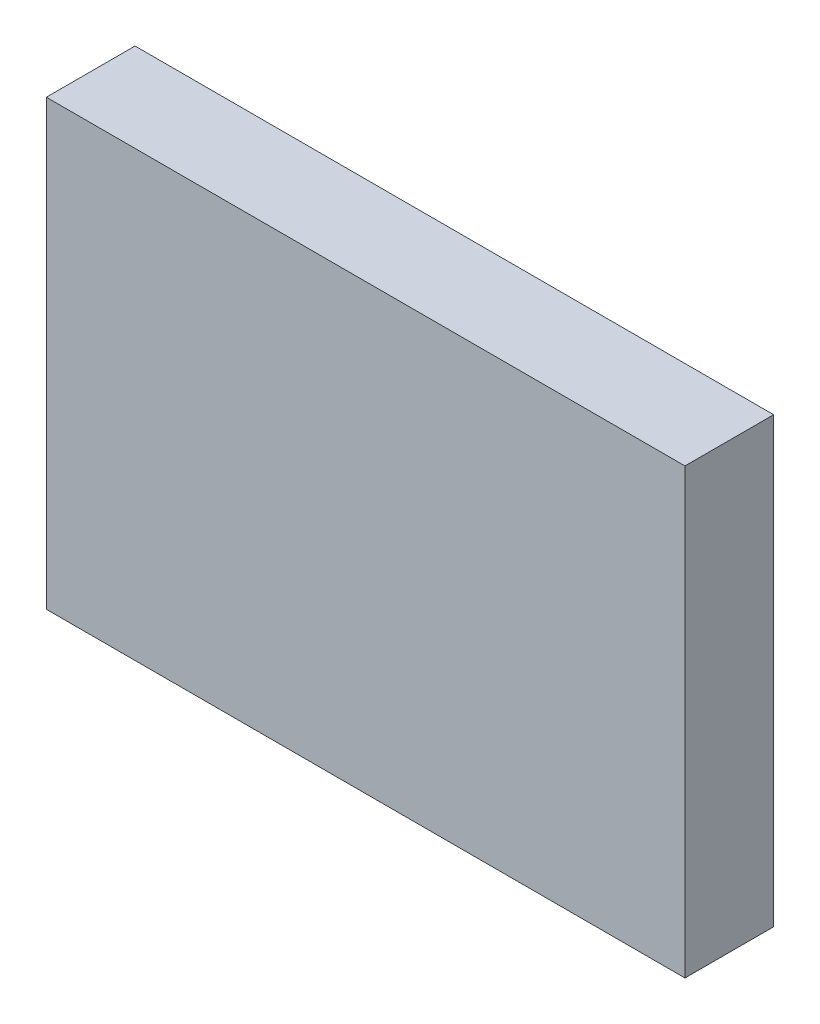
ISO-10303-21;
HEADER;
FILE_DESCRIPTION(('STEP AP214'),'2;1');
FILE_NAME('part.step','',(''),(''),'','','');
FILE_SCHEMA(('AUTOMOTIVE_DESIGN { 1 0 10303 214 1 1 1 1 }'));
ENDSEC;
DATA;
#1=APPLICATION_CONTEXT('core data for automotive mechanical design processes');
#2=APPLICATION_PROTOCOL_DEFINITION('international standard','automotive_design',2000,#1);
#3=PRODUCT_CONTEXT('',#1,'mechanical');
#4=PRODUCT('Part','Part','',(#3));
#5=PRODUCT_RELATED_PRODUCT_CATEGORY('part','',(#4));
#6=PRODUCT_DEFINITION_FORMATION('','',#4);
#7=PRODUCT_DEFINITION_CONTEXT('part definition',#1,'design');
#8=PRODUCT_DEFINITION('design','',#6,#7);
#9=PRODUCT_DEFINITION_SHAPE('','',#8);
#10=(LENGTH_UNIT() NAMED_UNIT(*) SI_UNIT(.MILLI.,.METRE.));
#11=(NAMED_UNIT(*) PLANE_ANGLE_UNIT() SI_UNIT($,.RADIAN.));
#12=(NAMED_UNIT(*) SI_UNIT($,.STERADIAN.) SOLID_ANGLE_UNIT());
#13=UNCERTAINTY_MEASURE_WITH_UNIT(LENGTH_MEASURE(1.E-05),#10,'distance_accuracy_value','');
#14=(GEOMETRIC_REPRESENTATION_CONTEXT(3) GLOBAL_UNCERTAINTY_ASSIGNED_CONTEXT((#13)) GLOBAL_UNIT_ASSIGNED_CONTEXT((#10,
#11,#12)) REPRESENTATION_CONTEXT('',''));
#15=CARTESIAN_POINT('',(0.,0.,0.));
#16=DIRECTION('',(0.,0.,1.));
#17=DIRECTION('',(1.,0.,0.));
#18=AXIS2_PLACEMENT_3D('',#15,#16,#17);
#19=CARTESIAN_POINT('',(0.,0.,10.));
#20=DIRECTION('',(1.,0.,0.));
#21=DIRECTION('',(0.,0.,-1.));
#22=AXIS2_PLACEMENT_3D('',#19,#20,#21);
#23=PLANE('',#22);
#24=DIRECTION('',(0.,-1.,0.));
#25=VECTOR('',#24,1.);
#26=CARTESIAN_POINT('',(0.,0.,0.));
#27=LINE('',#26,#25);
#28=CARTESIAN_POINT('',(0.,50.,0.));
#29=VERTEX_POINT('',#28);
#30=CARTESIAN_POINT('',(0.,0.,0.));
#31=VERTEX_POINT('',#30);
#32=EDGE_CURVE('E98',#29,#31,#27,.T.);
#33=ORIENTED_EDGE('',*,*,#32,.T.);
#34=DIRECTION('',(0.,0.,-1.));
#35=VECTOR('',#34,1.);
#36=CARTESIAN_POINT('',(0.,0.,10.));
#37=LINE('',#36,#35);
#38=CARTESIAN_POINT('',(0.,0.,10.));
#39=VERTEX_POINT('',#38);
#40=EDGE_CURVE('E11',#39,#31,#37,.T.);
#41=ORIENTED_EDGE('',*,*,#40,.F.);
#42=DIRECTION('',(0.,-1.,0.));
#43=VECTOR('',#42,1.);
#44=CARTESIAN_POINT('',(0.,0.,10.));
#45=LINE('',#44,#43);
#46=CARTESIAN_POINT('',(0.,50.,10.));
#47=VERTEX_POINT('',#46);
#48=EDGE_CURVE('E86',#47,#39,#45,.T.);
#49=ORIENTED_EDGE('',*,*,#48,.F.);
#50=DIRECTION('',(0.,0.,-1.));
#51=VECTOR('',#50,1.);
#52=CARTESIAN_POINT('',(0.,50.,10.));
#53=LINE('',#52,#51);
#54=EDGE_CURVE('E94',#47,#29,#53,.T.);
#55=ORIENTED_EDGE('',*,*,#54,.T.);
#56=EDGE_LOOP('',(#33,#41,#49,#55));
#57=FACE_BOUND('',#56,.T.);
#58=ADVANCED_FACE('F35',(#57),#23,.F.);
#59=CARTESIAN_POINT('',(0.,0.,10.));
#60=DIRECTION('',(0.,1.,0.));
#61=DIRECTION('',(0.,0.,1.));
#62=AXIS2_PLACEMENT_3D('',#59,#60,#61);
#63=PLANE('',#62);
#64=DIRECTION('',(1.,0.,0.));
#65=VECTOR('',#64,1.);
#66=CARTESIAN_POINT('',(0.,0.,0.));
#67=LINE('',#66,#65);
#68=CARTESIAN_POINT('',(72.,0.,0.));
#69=VERTEX_POINT('',#68);
#70=EDGE_CURVE('E90',#31,#69,#67,.T.);
#71=ORIENTED_EDGE('',*,*,#70,.T.);
#72=DIRECTION('',(0.,0.,-1.));
#73=VECTOR('',#72,1.);
#74=CARTESIAN_POINT('',(72.,0.,10.));
#75=LINE('',#74,#73);
#76=CARTESIAN_POINT('',(72.,0.,10.));
#77=VERTEX_POINT('',#76);
#78=EDGE_CURVE('E43',#77,#69,#75,.T.);
#79=ORIENTED_EDGE('',*,*,#78,.F.);
#80=DIRECTION('',(1.,0.,0.));
#81=VECTOR('',#80,1.);
#82=CARTESIAN_POINT('',(0.,0.,10.));
#83=LINE('',#82,#81);
#84=EDGE_CURVE('E81',#39,#77,#83,.T.);
#85=ORIENTED_EDGE('',*,*,#84,.F.);
#86=ORIENTED_EDGE('',*,*,#40,.T.);
#87=EDGE_LOOP('',(#71,#79,#85,#86));
#88=FACE_BOUND('',#87,.T.);
#89=ADVANCED_FACE('F89',(#88),#63,.F.);
#90=CARTESIAN_POINT('',(72.,0.,10.));
#91=DIRECTION('',(-1.,0.,0.));
#92=DIRECTION('',(0.,0.,1.));
#93=AXIS2_PLACEMENT_3D('',#90,#91,#92);
#94=PLANE('',#93);
#95=DIRECTION('',(0.,1.,0.));
#96=VECTOR('',#95,1.);
#97=CARTESIAN_POINT('',(72.,0.,0.));
#98=LINE('',#97,#96);
#99=CARTESIAN_POINT('',(72.,50.,0.));
#100=VERTEX_POINT('',#99);
#101=EDGE_CURVE('E68',#69,#100,#98,.T.);
#102=ORIENTED_EDGE('',*,*,#101,.T.);
#103=DIRECTION('',(0.,0.,-1.));
#104=VECTOR('',#103,1.);
#105=CARTESIAN_POINT('',(72.,50.,10.));
#106=LINE('',#105,#104);
#107=CARTESIAN_POINT('',(72.,50.,10.));
#108=VERTEX_POINT('',#107);
#109=EDGE_CURVE('E91',#108,#100,#106,.T.);
#110=ORIENTED_EDGE('',*,*,#109,.F.);
#111=DIRECTION('',(0.,1.,0.));
#112=VECTOR('',#111,1.);
#113=CARTESIAN_POINT('',(72.,0.,10.));
#114=LINE('',#113,#112);
#115=EDGE_CURVE('E84',#77,#108,#114,.T.);
#116=ORIENTED_EDGE('',*,*,#115,.F.);
#117=ORIENTED_EDGE('',*,*,#78,.T.);
#118=EDGE_LOOP('',(#102,#110,#116,#117));
#119=FACE_BOUND('',#118,.T.);
#120=ADVANCED_FACE('F92',(#119),#94,.F.);
#121=CARTESIAN_POINT('',(0.,50.,10.));
#122=DIRECTION('',(0.,-1.,0.));
#123=DIRECTION('',(0.,0.,-1.));
#124=AXIS2_PLACEMENT_3D('',#121,#122,#123);
#125=PLANE('',#124);
#126=DIRECTION('',(-1.,0.,0.));
#127=VECTOR('',#126,1.);
#128=CARTESIAN_POINT('',(0.,50.,0.));
#129=LINE('',#128,#127);
#130=EDGE_CURVE('E74',#100,#29,#129,.T.);
#131=ORIENTED_EDGE('',*,*,#130,.T.);
#132=ORIENTED_EDGE('',*,*,#54,.F.);
#133=DIRECTION('',(-1.,0.,0.));
#134=VECTOR('',#133,1.);
#135=CARTESIAN_POINT('',(0.,50.,10.));
#136=LINE('',#135,#134);
#137=EDGE_CURVE('E51',#108,#47,#136,.T.);
#138=ORIENTED_EDGE('',*,*,#137,.F.);
#139=ORIENTED_EDGE('',*,*,#109,.T.);
#140=EDGE_LOOP('',(#131,#132,#138,#139));
#141=FACE_BOUND('',#140,.T.);
#142=ADVANCED_FACE('F105',(#141),#125,.F.);
#143=CARTESIAN_POINT('',(0.,0.,10.));
#144=DIRECTION('',(0.,0.,-1.));
#145=DIRECTION('',(-1.,0.,0.));
#146=AXIS2_PLACEMENT_3D('',#143,#144,#145);
#147=PLANE('',#146);
#148=ORIENTED_EDGE('',*,*,#48,.T.);
#149=ORIENTED_EDGE('',*,*,#84,.T.);
#150=ORIENTED_EDGE('',*,*,#115,.T.);
#151=ORIENTED_EDGE('',*,*,#137,.T.);
#152=EDGE_LOOP('',(#148,#149,#150,#151));
#153=FACE_BOUND('',#152,.T.);
#154=ADVANCED_FACE('F82',(#153),#147,.F.);
#155=CARTESIAN_POINT('',(0.,0.,0.));
#156=DIRECTION('',(0.,0.,-1.));
#157=DIRECTION('',(-1.,0.,0.));
#158=AXIS2_PLACEMENT_3D('',#155,#156,#157);
#159=PLANE('',#158);
#160=ORIENTED_EDGE('',*,*,#32,.F.);
#161=ORIENTED_EDGE('',*,*,#130,.F.);
#162=ORIENTED_EDGE('',*,*,#101,.F.);
#163=ORIENTED_EDGE('',*,*,#70,.F.);
#164=EDGE_LOOP('',(#160,#161,#162,#163));
#165=FACE_BOUND('',#164,.T.);
#166=ADVANCED_FACE('F108',(#165),#159,.T.);
#167=CLOSED_SHELL('',(#58,#89,#120,#142,#154,#166));
#168=MANIFOLD_SOLID_BREP('B2',#167);
#169=ADVANCED_BREP_SHAPE_REPRESENTATION('',(#18,#168),#14);
#170=SHAPE_DEFINITION_REPRESENTATION(#9,#169);
ENDSEC;
END-ISO-10303-21;
